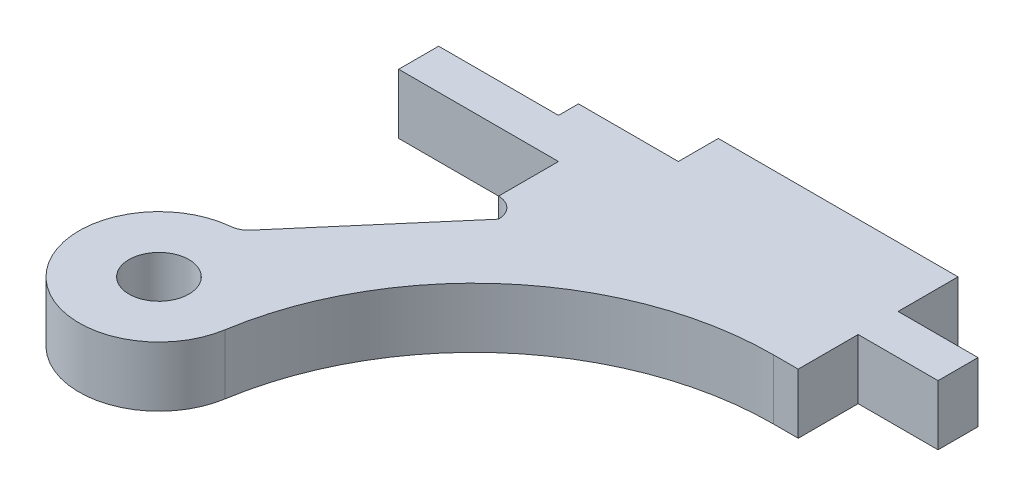
ISO-10303-21;
HEADER;
FILE_DESCRIPTION(('STEP AP214'),'2;1');
FILE_NAME('part.step','',(''),(''),'','','');
FILE_SCHEMA(('AUTOMOTIVE_DESIGN { 1 0 10303 214 1 1 1 1 }'));
ENDSEC;
DATA;
#1=APPLICATION_CONTEXT('core data for automotive mechanical design processes');
#2=APPLICATION_PROTOCOL_DEFINITION('international standard','automotive_design',2000,#1);
#3=PRODUCT_CONTEXT('',#1,'mechanical');
#4=PRODUCT('Part','Part','',(#3));
#5=PRODUCT_RELATED_PRODUCT_CATEGORY('part','',(#4));
#6=PRODUCT_DEFINITION_FORMATION('','',#4);
#7=PRODUCT_DEFINITION_CONTEXT('part definition',#1,'design');
#8=PRODUCT_DEFINITION('design','',#6,#7);
#9=PRODUCT_DEFINITION_SHAPE('','',#8);
#10=(LENGTH_UNIT() NAMED_UNIT(*) SI_UNIT(.MILLI.,.METRE.));
#11=(NAMED_UNIT(*) PLANE_ANGLE_UNIT() SI_UNIT($,.RADIAN.));
#12=(NAMED_UNIT(*) SI_UNIT($,.STERADIAN.) SOLID_ANGLE_UNIT());
#13=UNCERTAINTY_MEASURE_WITH_UNIT(LENGTH_MEASURE(1.E-05),#10,'distance_accuracy_value','');
#14=(GEOMETRIC_REPRESENTATION_CONTEXT(3) GLOBAL_UNCERTAINTY_ASSIGNED_CONTEXT((#13)) GLOBAL_UNIT_ASSIGNED_CONTEXT((#10,
#11,#12)) REPRESENTATION_CONTEXT('',''));
#15=CARTESIAN_POINT('',(0.,0.,0.));
#16=DIRECTION('',(0.,0.,1.));
#17=DIRECTION('',(1.,0.,0.));
#18=AXIS2_PLACEMENT_3D('',#15,#16,#17);
#19=CARTESIAN_POINT('',(41421.3052724861,-444.93949549037,-1.49999999996192));
#20=DIRECTION('',(0.,1.,0.));
#21=DIRECTION('',(1.,0.,0.));
#22=AXIS2_PLACEMENT_3D('',#19,#20,#21);
#23=PLANE('',#22);
#24=CARTESIAN_POINT('',(41421.3052724861,-444.93949549037,-1.49999999996192));
#25=DIRECTION('',(0.,-1.,0.));
#26=DIRECTION('',(1.,0.,0.));
#27=AXIS2_PLACEMENT_3D('',#24,#25,#26);
#28=CIRCLE('',#27,0.99999999999878);
#29=CARTESIAN_POINT('',(41421.3052724861,-444.93949549037,-2.49999999996181));
#30=VERTEX_POINT('',#29);
#31=CARTESIAN_POINT('',(41422.3052724861,-444.93949549037,-1.49999999996314));
#32=VERTEX_POINT('',#31);
#33=EDGE_CURVE('E238',#30,#32,#28,.T.);
#34=ORIENTED_EDGE('',*,*,#33,.T.);
#35=DIRECTION('',(-0.650791373461382,0.,0.759256602360656));
#36=VECTOR('',#35,1.);
#37=CARTESIAN_POINT('',(41422.3052724861,-444.93949549037,-1.49999999996314));
#38=LINE('',#37,#36);
#39=CARTESIAN_POINT('',(41416.5848242782,-444.93949549037,5.17385624268685));
#40=VERTEX_POINT('',#39);
#41=EDGE_CURVE('E131',#32,#40,#38,.T.);
#42=ORIENTED_EDGE('',*,*,#41,.T.);
#43=CARTESIAN_POINT('',(41415.8255676757,-444.93949549037,4.52306486902837));
#44=DIRECTION('',(0.,-1.,0.));
#45=DIRECTION('',(1.,0.,0.));
#46=AXIS2_PLACEMENT_3D('',#43,#44,#45);
#47=CIRCLE('',#46,1.00000000022187);
#48=CARTESIAN_POINT('',(41415.9215086378,-444.93949549037,5.51845189556954));
#49=VERTEX_POINT('',#48);
#50=EDGE_CURVE('E286',#40,#49,#47,.T.);
#51=ORIENTED_EDGE('',*,*,#50,.T.);
#52=CARTESIAN_POINT('',(41416.3052724861,-444.939495490369,9.50000000003803));
#53=DIRECTION('',(0.,1.,0.));
#54=DIRECTION('',(1.,0.,0.));
#55=AXIS2_PLACEMENT_3D('',#52,#53,#54);
#56=CIRCLE('',#55,3.99999999992394);
#57=CARTESIAN_POINT('',(41420.2550962837,-444.939495490369,10.1315789473974));
#58=VERTEX_POINT('',#57);
#59=EDGE_CURVE('E305',#49,#58,#56,.T.);
#60=ORIENTED_EDGE('',*,*,#59,.T.);
#61=CARTESIAN_POINT('',(41435.0669355253,-444.939495490369,12.500000000038));
#62=DIRECTION('',(0.,-1.,0.));
#63=DIRECTION('',(1.,0.,0.));
#64=AXIS2_PLACEMENT_3D('',#61,#62,#63);
#65=CIRCLE('',#64,14.9999999999983);
#66=CARTESIAN_POINT('',(41435.0669355253,-444.93949549037,-2.49999999995931));
#67=VERTEX_POINT('',#66);
#68=EDGE_CURVE('E302',#58,#67,#65,.T.);
#69=ORIENTED_EDGE('',*,*,#68,.T.);
#70=DIRECTION('',(1.,0.,-2.10687736092604E-12));
#71=VECTOR('',#70,1.);
#72=CARTESIAN_POINT('',(41436.3052724861,-444.93949549037,-2.49999999996192));
#73=LINE('',#72,#71);
#74=CARTESIAN_POINT('',(41436.3052724861,-444.93949549037,-2.49999999996192));
#75=VERTEX_POINT('',#74);
#76=EDGE_CURVE('E304',#67,#75,#73,.T.);
#77=ORIENTED_EDGE('',*,*,#76,.T.);
#78=DIRECTION('',(0.,0.,-1.));
#79=VECTOR('',#78,1.);
#80=CARTESIAN_POINT('',(41436.3052724861,-444.93949549037,-5.49999999996192));
#81=LINE('',#80,#79);
#82=CARTESIAN_POINT('',(41436.3052724861,-444.93949549037,-5.49999999996192));
#83=VERTEX_POINT('',#82);
#84=EDGE_CURVE('E307',#75,#83,#81,.T.);
#85=ORIENTED_EDGE('',*,*,#84,.T.);
#86=DIRECTION('',(1.,0.,0.));
#87=VECTOR('',#86,1.);
#88=CARTESIAN_POINT('',(41440.3052724861,-444.93949549037,-5.49999999996192));
#89=LINE('',#88,#87);
#90=CARTESIAN_POINT('',(41440.3052724861,-444.93949549037,-5.49999999996192));
#91=VERTEX_POINT('',#90);
#92=EDGE_CURVE('E313',#83,#91,#89,.T.);
#93=ORIENTED_EDGE('',*,*,#92,.T.);
#94=DIRECTION('',(0.,0.,-1.));
#95=VECTOR('',#94,1.);
#96=CARTESIAN_POINT('',(41440.3052724861,-444.93949549037,-7.49999999996193));
#97=LINE('',#96,#95);
#98=CARTESIAN_POINT('',(41440.3052724861,-444.93949549037,-7.49999999996193));
#99=VERTEX_POINT('',#98);
#100=EDGE_CURVE('E315',#91,#99,#97,.T.);
#101=ORIENTED_EDGE('',*,*,#100,.T.);
#102=DIRECTION('',(-1.,0.,0.));
#103=VECTOR('',#102,1.);
#104=CARTESIAN_POINT('',(41436.3052724861,-444.93949549037,-7.49999999996193));
#105=LINE('',#104,#103);
#106=CARTESIAN_POINT('',(41436.3052724861,-444.93949549037,-7.49999999996193));
#107=VERTEX_POINT('',#106);
#108=EDGE_CURVE('E317',#99,#107,#105,.T.);
#109=ORIENTED_EDGE('',*,*,#108,.T.);
#110=DIRECTION('',(0.,0.,-1.));
#111=VECTOR('',#110,1.);
#112=CARTESIAN_POINT('',(41436.3052724861,-444.93949549037,-10.4999999999619));
#113=LINE('',#112,#111);
#114=CARTESIAN_POINT('',(41436.3052724861,-444.93949549037,-10.4999999999619));
#115=VERTEX_POINT('',#114);
#116=EDGE_CURVE('E319',#107,#115,#113,.T.);
#117=ORIENTED_EDGE('',*,*,#116,.T.);
#118=DIRECTION('',(-1.,0.,0.));
#119=VECTOR('',#118,1.);
#120=CARTESIAN_POINT('',(41424.3052724861,-444.93949549037,-10.4999999999619));
#121=LINE('',#120,#119);
#122=CARTESIAN_POINT('',(41424.3052724861,-444.93949549037,-10.4999999999619));
#123=VERTEX_POINT('',#122);
#124=EDGE_CURVE('E321',#115,#123,#121,.T.);
#125=ORIENTED_EDGE('',*,*,#124,.T.);
#126=DIRECTION('',(0.,0.,1.));
#127=VECTOR('',#126,1.);
#128=CARTESIAN_POINT('',(41424.3052724861,-444.93949549037,-8.49999999996193));
#129=LINE('',#128,#127);
#130=CARTESIAN_POINT('',(41424.3052724861,-444.93949549037,-8.49999999996193));
#131=VERTEX_POINT('',#130);
#132=EDGE_CURVE('E323',#123,#131,#129,.T.);
#133=ORIENTED_EDGE('',*,*,#132,.T.);
#134=DIRECTION('',(-1.,0.,0.));
#135=VECTOR('',#134,1.);
#136=CARTESIAN_POINT('',(41419.3052724861,-444.93949549037,-8.49999999996193));
#137=LINE('',#136,#135);
#138=CARTESIAN_POINT('',(41419.3052724861,-444.93949549037,-8.49999999996193));
#139=VERTEX_POINT('',#138);
#140=EDGE_CURVE('E325',#131,#139,#137,.T.);
#141=ORIENTED_EDGE('',*,*,#140,.T.);
#142=DIRECTION('',(0.,0.,1.));
#143=VECTOR('',#142,1.);
#144=CARTESIAN_POINT('',(41419.3052724861,-444.93949549037,-7.49999999996198));
#145=LINE('',#144,#143);
#146=CARTESIAN_POINT('',(41419.3052724861,-444.93949549037,-7.49999999996198));
#147=VERTEX_POINT('',#146);
#148=EDGE_CURVE('E327',#139,#147,#145,.T.);
#149=ORIENTED_EDGE('',*,*,#148,.T.);
#150=DIRECTION('',(-1.,0.,0.));
#151=VECTOR('',#150,1.);
#152=CARTESIAN_POINT('',(41413.3052724861,-444.93949549037,-7.49999999996198));
#153=LINE('',#152,#151);
#154=CARTESIAN_POINT('',(41413.3052724861,-444.93949549037,-7.49999999996198));
#155=VERTEX_POINT('',#154);
#156=EDGE_CURVE('E183',#147,#155,#153,.T.);
#157=ORIENTED_EDGE('',*,*,#156,.T.);
#158=DIRECTION('',(0.,0.,1.));
#159=VECTOR('',#158,1.);
#160=CARTESIAN_POINT('',(41413.3052724861,-444.93949549037,-5.49999999996187));
#161=LINE('',#160,#159);
#162=CARTESIAN_POINT('',(41413.3052724861,-444.93949549037,-5.49999999996187));
#163=VERTEX_POINT('',#162);
#164=EDGE_CURVE('E177',#155,#163,#161,.T.);
#165=ORIENTED_EDGE('',*,*,#164,.T.);
#166=DIRECTION('',(1.,0.,0.));
#167=VECTOR('',#166,1.);
#168=CARTESIAN_POINT('',(41421.3052724861,-444.93949549037,-5.49999999996187));
#169=LINE('',#168,#167);
#170=CARTESIAN_POINT('',(41421.3052724861,-444.93949549037,-5.49999999996187));
#171=VERTEX_POINT('',#170);
#172=EDGE_CURVE('E181',#163,#171,#169,.T.);
#173=ORIENTED_EDGE('',*,*,#172,.T.);
#174=DIRECTION('',(0.,0.,1.));
#175=VECTOR('',#174,1.);
#176=CARTESIAN_POINT('',(41421.3052724861,-444.93949549037,-2.49999999996181));
#177=LINE('',#176,#175);
#178=EDGE_CURVE('E55',#171,#30,#177,.T.);
#179=ORIENTED_EDGE('',*,*,#178,.T.);
#180=EDGE_LOOP('',(#34,#42,#51,#60,#69,#77,#85,#93,#101,#109,#117,#125,#133,#141,#149,#157,#165,
#173,#179));
#181=FACE_BOUND('',#180,.T.);
#182=CARTESIAN_POINT('',(41416.3052724861,-444.939495490369,9.50000000003803));
#183=DIRECTION('',(0.,1.,0.));
#184=DIRECTION('',(1.,0.,0.));
#185=AXIS2_PLACEMENT_3D('',#182,#183,#184);
#186=CIRCLE('',#185,1.50000000000178);
#187=CARTESIAN_POINT('',(41417.8052724861,-444.939495490369,9.50000000003803));
#188=VERTEX_POINT('',#187);
#189=EDGE_CURVE('E205',#188,#188,#186,.T.);
#190=ORIENTED_EDGE('',*,*,#189,.F.);
#191=EDGE_LOOP('',(#190));
#192=FACE_BOUND('',#191,.T.);
#193=ADVANCED_FACE('F38',(#181,#192),#23,.T.);
#194=CARTESIAN_POINT('',(41421.3052724861,-447.93949549037,-1.49999999996192));
#195=DIRECTION('',(0.,1.,0.));
#196=DIRECTION('',(1.,0.,0.));
#197=AXIS2_PLACEMENT_3D('',#194,#195,#196);
#198=PLANE('',#197);
#199=CARTESIAN_POINT('',(41421.3052724861,-447.93949549037,-1.49999999996192));
#200=DIRECTION('',(0.,-1.,0.));
#201=DIRECTION('',(1.,0.,0.));
#202=AXIS2_PLACEMENT_3D('',#199,#200,#201);
#203=CIRCLE('',#202,0.99999999999878);
#204=CARTESIAN_POINT('',(41421.3052724861,-447.93949549037,-2.49999999996181));
#205=VERTEX_POINT('',#204);
#206=CARTESIAN_POINT('',(41422.3052724861,-447.93949549037,-1.49999999996314));
#207=VERTEX_POINT('',#206);
#208=EDGE_CURVE('E201',#205,#207,#203,.T.);
#209=ORIENTED_EDGE('',*,*,#208,.F.);
#210=DIRECTION('',(0.,0.,1.));
#211=VECTOR('',#210,1.);
#212=CARTESIAN_POINT('',(41421.3052724861,-447.93949549037,-2.49999999996181));
#213=LINE('',#212,#211);
#214=CARTESIAN_POINT('',(41421.3052724861,-447.93949549037,-5.49999999996187));
#215=VERTEX_POINT('',#214);
#216=EDGE_CURVE('E123',#215,#205,#213,.T.);
#217=ORIENTED_EDGE('',*,*,#216,.F.);
#218=DIRECTION('',(1.,0.,0.));
#219=VECTOR('',#218,1.);
#220=CARTESIAN_POINT('',(41421.3052724861,-447.93949549037,-5.49999999996187));
#221=LINE('',#220,#219);
#222=CARTESIAN_POINT('',(41413.3052724861,-447.93949549037,-5.49999999996187));
#223=VERTEX_POINT('',#222);
#224=EDGE_CURVE('E117',#223,#215,#221,.T.);
#225=ORIENTED_EDGE('',*,*,#224,.F.);
#226=DIRECTION('',(0.,0.,1.));
#227=VECTOR('',#226,1.);
#228=CARTESIAN_POINT('',(41413.3052724861,-447.93949549037,-5.49999999996187));
#229=LINE('',#228,#227);
#230=CARTESIAN_POINT('',(41413.3052724861,-447.93949549037,-7.49999999996198));
#231=VERTEX_POINT('',#230);
#232=EDGE_CURVE('E191',#231,#223,#229,.T.);
#233=ORIENTED_EDGE('',*,*,#232,.F.);
#234=DIRECTION('',(-1.,0.,0.));
#235=VECTOR('',#234,1.);
#236=CARTESIAN_POINT('',(41413.3052724861,-447.93949549037,-7.49999999996198));
#237=LINE('',#236,#235);
#238=CARTESIAN_POINT('',(41419.3052724861,-447.93949549037,-7.49999999996198));
#239=VERTEX_POINT('',#238);
#240=EDGE_CURVE('E233',#239,#231,#237,.T.);
#241=ORIENTED_EDGE('',*,*,#240,.F.);
#242=DIRECTION('',(0.,0.,1.));
#243=VECTOR('',#242,1.);
#244=CARTESIAN_POINT('',(41419.3052724861,-447.93949549037,-7.49999999996198));
#245=LINE('',#244,#243);
#246=CARTESIAN_POINT('',(41419.3052724861,-447.93949549037,-8.49999999996193));
#247=VERTEX_POINT('',#246);
#248=EDGE_CURVE('E231',#247,#239,#245,.T.);
#249=ORIENTED_EDGE('',*,*,#248,.F.);
#250=DIRECTION('',(-1.,0.,0.));
#251=VECTOR('',#250,1.);
#252=CARTESIAN_POINT('',(41419.3052724861,-447.93949549037,-8.49999999996193));
#253=LINE('',#252,#251);
#254=CARTESIAN_POINT('',(41424.3052724861,-447.93949549037,-8.49999999996193));
#255=VERTEX_POINT('',#254);
#256=EDGE_CURVE('E229',#255,#247,#253,.T.);
#257=ORIENTED_EDGE('',*,*,#256,.F.);
#258=DIRECTION('',(0.,0.,1.));
#259=VECTOR('',#258,1.);
#260=CARTESIAN_POINT('',(41424.3052724861,-447.93949549037,-8.49999999996193));
#261=LINE('',#260,#259);
#262=CARTESIAN_POINT('',(41424.3052724861,-447.93949549037,-10.4999999999619));
#263=VERTEX_POINT('',#262);
#264=EDGE_CURVE('E227',#263,#255,#261,.T.);
#265=ORIENTED_EDGE('',*,*,#264,.F.);
#266=DIRECTION('',(-1.,0.,0.));
#267=VECTOR('',#266,1.);
#268=CARTESIAN_POINT('',(41424.3052724861,-447.93949549037,-10.4999999999619));
#269=LINE('',#268,#267);
#270=CARTESIAN_POINT('',(41436.3052724861,-447.93949549037,-10.4999999999619));
#271=VERTEX_POINT('',#270);
#272=EDGE_CURVE('E225',#271,#263,#269,.T.);
#273=ORIENTED_EDGE('',*,*,#272,.F.);
#274=DIRECTION('',(0.,0.,-1.));
#275=VECTOR('',#274,1.);
#276=CARTESIAN_POINT('',(41436.3052724861,-447.93949549037,-10.4999999999619));
#277=LINE('',#276,#275);
#278=CARTESIAN_POINT('',(41436.3052724861,-447.93949549037,-7.49999999996193));
#279=VERTEX_POINT('',#278);
#280=EDGE_CURVE('E223',#279,#271,#277,.T.);
#281=ORIENTED_EDGE('',*,*,#280,.F.);
#282=DIRECTION('',(-1.,0.,0.));
#283=VECTOR('',#282,1.);
#284=CARTESIAN_POINT('',(41436.3052724861,-447.93949549037,-7.49999999996193));
#285=LINE('',#284,#283);
#286=CARTESIAN_POINT('',(41440.3052724861,-447.93949549037,-7.49999999996193));
#287=VERTEX_POINT('',#286);
#288=EDGE_CURVE('E221',#287,#279,#285,.T.);
#289=ORIENTED_EDGE('',*,*,#288,.F.);
#290=DIRECTION('',(0.,0.,-1.));
#291=VECTOR('',#290,1.);
#292=CARTESIAN_POINT('',(41440.3052724861,-447.93949549037,-7.49999999996193));
#293=LINE('',#292,#291);
#294=CARTESIAN_POINT('',(41440.3052724861,-447.93949549037,-5.49999999996192));
#295=VERTEX_POINT('',#294);
#296=EDGE_CURVE('E219',#295,#287,#293,.T.);
#297=ORIENTED_EDGE('',*,*,#296,.F.);
#298=DIRECTION('',(1.,0.,0.));
#299=VECTOR('',#298,1.);
#300=CARTESIAN_POINT('',(41440.3052724861,-447.93949549037,-5.49999999996192));
#301=LINE('',#300,#299);
#302=CARTESIAN_POINT('',(41436.3052724861,-447.93949549037,-5.49999999996192));
#303=VERTEX_POINT('',#302);
#304=EDGE_CURVE('E217',#303,#295,#301,.T.);
#305=ORIENTED_EDGE('',*,*,#304,.F.);
#306=DIRECTION('',(0.,0.,-1.));
#307=VECTOR('',#306,1.);
#308=CARTESIAN_POINT('',(41436.3052724861,-447.93949549037,-5.49999999996192));
#309=LINE('',#308,#307);
#310=CARTESIAN_POINT('',(41436.3052724861,-447.93949549037,-2.49999999996192));
#311=VERTEX_POINT('',#310);
#312=EDGE_CURVE('E215',#311,#303,#309,.T.);
#313=ORIENTED_EDGE('',*,*,#312,.F.);
#314=DIRECTION('',(1.,0.,-2.10687736092604E-12));
#315=VECTOR('',#314,1.);
#316=CARTESIAN_POINT('',(41436.3052724861,-447.93949549037,-2.49999999996192));
#317=LINE('',#316,#315);
#318=CARTESIAN_POINT('',(41435.0669355253,-447.93949549037,-2.49999999995931));
#319=VERTEX_POINT('',#318);
#320=EDGE_CURVE('E213',#319,#311,#317,.T.);
#321=ORIENTED_EDGE('',*,*,#320,.F.);
#322=CARTESIAN_POINT('',(41435.0669355253,-447.939495490369,12.500000000038));
#323=DIRECTION('',(0.,-1.,0.));
#324=DIRECTION('',(1.,0.,0.));
#325=AXIS2_PLACEMENT_3D('',#322,#323,#324);
#326=CIRCLE('',#325,14.9999999999983);
#327=CARTESIAN_POINT('',(41420.2550962837,-447.939495490369,10.1315789473974));
#328=VERTEX_POINT('',#327);
#329=EDGE_CURVE('E211',#328,#319,#326,.T.);
#330=ORIENTED_EDGE('',*,*,#329,.F.);
#331=CARTESIAN_POINT('',(41416.3052724861,-447.939495490369,9.50000000003803));
#332=DIRECTION('',(0.,1.,0.));
#333=DIRECTION('',(1.,0.,0.));
#334=AXIS2_PLACEMENT_3D('',#331,#332,#333);
#335=CIRCLE('',#334,3.99999999992394);
#336=CARTESIAN_POINT('',(41415.9215086378,-447.93949549037,5.51845189556954));
#337=VERTEX_POINT('',#336);
#338=EDGE_CURVE('E209',#337,#328,#335,.T.);
#339=ORIENTED_EDGE('',*,*,#338,.F.);
#340=CARTESIAN_POINT('',(41415.8255676757,-447.93949549037,4.52306486902837));
#341=DIRECTION('',(0.,-1.,0.));
#342=DIRECTION('',(1.,0.,0.));
#343=AXIS2_PLACEMENT_3D('',#340,#341,#342);
#344=CIRCLE('',#343,1.00000000022187);
#345=CARTESIAN_POINT('',(41416.5848242782,-447.93949549037,5.17385624268685));
#346=VERTEX_POINT('',#345);
#347=EDGE_CURVE('E207',#346,#337,#344,.T.);
#348=ORIENTED_EDGE('',*,*,#347,.F.);
#349=DIRECTION('',(-0.650791373461382,0.,0.759256602360656));
#350=VECTOR('',#349,1.);
#351=CARTESIAN_POINT('',(41422.3052724861,-447.93949549037,-1.49999999996314));
#352=LINE('',#351,#350);
#353=EDGE_CURVE('E204',#207,#346,#352,.T.);
#354=ORIENTED_EDGE('',*,*,#353,.F.);
#355=EDGE_LOOP('',(#209,#217,#225,#233,#241,#249,#257,#265,#273,#281,#289,#297,#305,#313,#321,
#330,#339,#348,#354));
#356=FACE_BOUND('',#355,.T.);
#357=CARTESIAN_POINT('',(41416.3052724861,-447.939495490369,9.50000000003803));
#358=DIRECTION('',(0.,1.,0.));
#359=DIRECTION('',(1.,0.,0.));
#360=AXIS2_PLACEMENT_3D('',#357,#358,#359);
#361=CIRCLE('',#360,1.50000000000178);
#362=CARTESIAN_POINT('',(41417.8052724861,-447.939495490369,9.50000000003803));
#363=VERTEX_POINT('',#362);
#364=EDGE_CURVE('E565',#363,#363,#361,.T.);
#365=ORIENTED_EDGE('',*,*,#364,.T.);
#366=EDGE_LOOP('',(#365));
#367=FACE_BOUND('',#366,.T.);
#368=ADVANCED_FACE('F290',(#356,#367),#198,.F.);
#369=CARTESIAN_POINT('',(41421.3052724861,-444.93949549037,-1.49999999996192));
#370=DIRECTION('',(0.,-1.,0.));
#371=DIRECTION('',(-1.,0.,0.));
#372=AXIS2_PLACEMENT_3D('',#369,#370,#371);
#373=CYLINDRICAL_SURFACE('',#372,0.99999999999878);
#374=ORIENTED_EDGE('',*,*,#208,.T.);
#375=DIRECTION('',(0.,-1.,0.));
#376=VECTOR('',#375,1.);
#377=CARTESIAN_POINT('',(41422.3052724861,-444.93949549037,-1.49999999996314));
#378=LINE('',#377,#376);
#379=EDGE_CURVE('E11',#32,#207,#378,.T.);
#380=ORIENTED_EDGE('',*,*,#379,.F.);
#381=ORIENTED_EDGE('',*,*,#33,.F.);
#382=DIRECTION('',(0.,-1.,0.));
#383=VECTOR('',#382,1.);
#384=CARTESIAN_POINT('',(41421.3052724861,-444.93949549037,-2.49999999996181));
#385=LINE('',#384,#383);
#386=EDGE_CURVE('E197',#30,#205,#385,.T.);
#387=ORIENTED_EDGE('',*,*,#386,.T.);
#388=EDGE_LOOP('',(#374,#380,#381,#387));
#389=FACE_BOUND('',#388,.T.);
#390=ADVANCED_FACE('F40',(#389),#373,.F.);
#391=CARTESIAN_POINT('',(41422.3052724861,-444.93949549037,-1.49999999996314));
#392=DIRECTION('',(0.759256602360656,0.,0.650791373461383));
#393=DIRECTION('',(0.650791373461383,0.,-0.759256602360656));
#394=AXIS2_PLACEMENT_3D('',#391,#392,#393);
#395=PLANE('',#394);
#396=ORIENTED_EDGE('',*,*,#353,.T.);
#397=DIRECTION('',(0.,-1.,0.));
#398=VECTOR('',#397,1.);
#399=CARTESIAN_POINT('',(41416.5848242782,-444.93949549037,5.17385624268685));
#400=LINE('',#399,#398);
#401=EDGE_CURVE('E47',#40,#346,#400,.T.);
#402=ORIENTED_EDGE('',*,*,#401,.F.);
#403=ORIENTED_EDGE('',*,*,#41,.F.);
#404=ORIENTED_EDGE('',*,*,#379,.T.);
#405=EDGE_LOOP('',(#396,#402,#403,#404));
#406=FACE_BOUND('',#405,.T.);
#407=ADVANCED_FACE('F361',(#406),#395,.F.);
#408=CARTESIAN_POINT('',(41415.8255676757,-444.93949549037,4.52306486902837));
#409=DIRECTION('',(0.,-1.,0.));
#410=DIRECTION('',(-1.,0.,0.));
#411=AXIS2_PLACEMENT_3D('',#408,#409,#410);
#412=CYLINDRICAL_SURFACE('',#411,1.00000000022187);
#413=ORIENTED_EDGE('',*,*,#347,.T.);
#414=DIRECTION('',(0.,-1.,0.));
#415=VECTOR('',#414,1.);
#416=CARTESIAN_POINT('',(41415.9215086378,-444.93949549037,5.51845189556954));
#417=LINE('',#416,#415);
#418=EDGE_CURVE('E278',#49,#337,#417,.T.);
#419=ORIENTED_EDGE('',*,*,#418,.F.);
#420=ORIENTED_EDGE('',*,*,#50,.F.);
#421=ORIENTED_EDGE('',*,*,#401,.T.);
#422=EDGE_LOOP('',(#413,#419,#420,#421));
#423=FACE_BOUND('',#422,.T.);
#424=ADVANCED_FACE('F284',(#423),#412,.F.);
#425=CARTESIAN_POINT('',(41416.3052724861,-444.939495490369,9.50000000003803));
#426=DIRECTION('',(0.,-1.,0.));
#427=DIRECTION('',(-1.,0.,0.));
#428=AXIS2_PLACEMENT_3D('',#425,#426,#427);
#429=CYLINDRICAL_SURFACE('',#428,3.99999999992394);
#430=ORIENTED_EDGE('',*,*,#338,.T.);
#431=DIRECTION('',(0.,-1.,0.));
#432=VECTOR('',#431,1.);
#433=CARTESIAN_POINT('',(41420.2550962837,-444.939495490369,10.1315789473974));
#434=LINE('',#433,#432);
#435=EDGE_CURVE('E275',#58,#328,#434,.T.);
#436=ORIENTED_EDGE('',*,*,#435,.F.);
#437=ORIENTED_EDGE('',*,*,#59,.F.);
#438=ORIENTED_EDGE('',*,*,#418,.T.);
#439=EDGE_LOOP('',(#430,#436,#437,#438));
#440=FACE_BOUND('',#439,.T.);
#441=ADVANCED_FACE('F296',(#440),#429,.T.);
#442=CARTESIAN_POINT('',(41435.0669355253,-444.939495490369,12.500000000038));
#443=DIRECTION('',(0.,-1.,0.));
#444=DIRECTION('',(-1.,0.,0.));
#445=AXIS2_PLACEMENT_3D('',#442,#443,#444);
#446=CYLINDRICAL_SURFACE('',#445,14.9999999999983);
#447=ORIENTED_EDGE('',*,*,#329,.T.);
#448=DIRECTION('',(0.,-1.,0.));
#449=VECTOR('',#448,1.);
#450=CARTESIAN_POINT('',(41435.0669355253,-444.93949549037,-2.49999999995931));
#451=LINE('',#450,#449);
#452=EDGE_CURVE('E272',#67,#319,#451,.T.);
#453=ORIENTED_EDGE('',*,*,#452,.F.);
#454=ORIENTED_EDGE('',*,*,#68,.F.);
#455=ORIENTED_EDGE('',*,*,#435,.T.);
#456=EDGE_LOOP('',(#447,#453,#454,#455));
#457=FACE_BOUND('',#456,.T.);
#458=ADVANCED_FACE('F300',(#457),#446,.F.);
#459=CARTESIAN_POINT('',(41436.3052724861,-444.93949549037,-2.49999999996192));
#460=DIRECTION('',(-2.10687736092604E-12,0.,-1.));
#461=DIRECTION('',(-1.,0.,2.10687736092604E-12));
#462=AXIS2_PLACEMENT_3D('',#459,#460,#461);
#463=PLANE('',#462);
#464=ORIENTED_EDGE('',*,*,#320,.T.);
#465=DIRECTION('',(0.,-1.,0.));
#466=VECTOR('',#465,1.);
#467=CARTESIAN_POINT('',(41436.3052724861,-444.93949549037,-2.49999999996192));
#468=LINE('',#467,#466);
#469=EDGE_CURVE('E269',#75,#311,#468,.T.);
#470=ORIENTED_EDGE('',*,*,#469,.F.);
#471=ORIENTED_EDGE('',*,*,#76,.F.);
#472=ORIENTED_EDGE('',*,*,#452,.T.);
#473=EDGE_LOOP('',(#464,#470,#471,#472));
#474=FACE_BOUND('',#473,.T.);
#475=ADVANCED_FACE('F374',(#474),#463,.F.);
#476=CARTESIAN_POINT('',(41436.3052724861,-444.93949549037,-5.49999999996192));
#477=DIRECTION('',(-1.,0.,0.));
#478=DIRECTION('',(0.,1.,0.));
#479=AXIS2_PLACEMENT_3D('',#476,#477,#478);
#480=PLANE('',#479);
#481=ORIENTED_EDGE('',*,*,#312,.T.);
#482=DIRECTION('',(0.,-1.,0.));
#483=VECTOR('',#482,1.);
#484=CARTESIAN_POINT('',(41436.3052724861,-444.93949549037,-5.49999999996192));
#485=LINE('',#484,#483);
#486=EDGE_CURVE('E266',#83,#303,#485,.T.);
#487=ORIENTED_EDGE('',*,*,#486,.F.);
#488=ORIENTED_EDGE('',*,*,#84,.F.);
#489=ORIENTED_EDGE('',*,*,#469,.T.);
#490=EDGE_LOOP('',(#481,#487,#488,#489));
#491=FACE_BOUND('',#490,.T.);
#492=ADVANCED_FACE('F377',(#491),#480,.F.);
#493=CARTESIAN_POINT('',(41440.3052724861,-444.93949549037,-5.49999999996192));
#494=DIRECTION('',(0.,0.,-1.));
#495=DIRECTION('',(0.,1.,0.));
#496=AXIS2_PLACEMENT_3D('',#493,#494,#495);
#497=PLANE('',#496);
#498=ORIENTED_EDGE('',*,*,#304,.T.);
#499=DIRECTION('',(0.,-1.,0.));
#500=VECTOR('',#499,1.);
#501=CARTESIAN_POINT('',(41440.3052724861,-444.93949549037,-5.49999999996192));
#502=LINE('',#501,#500);
#503=EDGE_CURVE('E263',#91,#295,#502,.T.);
#504=ORIENTED_EDGE('',*,*,#503,.F.);
#505=ORIENTED_EDGE('',*,*,#92,.F.);
#506=ORIENTED_EDGE('',*,*,#486,.T.);
#507=EDGE_LOOP('',(#498,#504,#505,#506));
#508=FACE_BOUND('',#507,.T.);
#509=ADVANCED_FACE('F381',(#508),#497,.F.);
#510=CARTESIAN_POINT('',(41440.3052724861,-444.93949549037,-7.49999999996193));
#511=DIRECTION('',(-1.,0.,0.));
#512=DIRECTION('',(0.,1.,0.));
#513=AXIS2_PLACEMENT_3D('',#510,#511,#512);
#514=PLANE('',#513);
#515=ORIENTED_EDGE('',*,*,#296,.T.);
#516=DIRECTION('',(0.,-1.,0.));
#517=VECTOR('',#516,1.);
#518=CARTESIAN_POINT('',(41440.3052724861,-444.93949549037,-7.49999999996193));
#519=LINE('',#518,#517);
#520=EDGE_CURVE('E260',#99,#287,#519,.T.);
#521=ORIENTED_EDGE('',*,*,#520,.F.);
#522=ORIENTED_EDGE('',*,*,#100,.F.);
#523=ORIENTED_EDGE('',*,*,#503,.T.);
#524=EDGE_LOOP('',(#515,#521,#522,#523));
#525=FACE_BOUND('',#524,.T.);
#526=ADVANCED_FACE('F385',(#525),#514,.F.);
#527=CARTESIAN_POINT('',(41436.3052724861,-444.93949549037,-7.49999999996193));
#528=DIRECTION('',(0.,0.,1.));
#529=DIRECTION('',(0.,-1.,0.));
#530=AXIS2_PLACEMENT_3D('',#527,#528,#529);
#531=PLANE('',#530);
#532=ORIENTED_EDGE('',*,*,#288,.T.);
#533=DIRECTION('',(0.,-1.,0.));
#534=VECTOR('',#533,1.);
#535=CARTESIAN_POINT('',(41436.3052724861,-444.93949549037,-7.49999999996193));
#536=LINE('',#535,#534);
#537=EDGE_CURVE('E257',#107,#279,#536,.T.);
#538=ORIENTED_EDGE('',*,*,#537,.F.);
#539=ORIENTED_EDGE('',*,*,#108,.F.);
#540=ORIENTED_EDGE('',*,*,#520,.T.);
#541=EDGE_LOOP('',(#532,#538,#539,#540));
#542=FACE_BOUND('',#541,.T.);
#543=ADVANCED_FACE('F389',(#542),#531,.F.);
#544=CARTESIAN_POINT('',(41436.3052724861,-444.93949549037,-10.4999999999619));
#545=DIRECTION('',(-1.,0.,0.));
#546=DIRECTION('',(0.,1.,0.));
#547=AXIS2_PLACEMENT_3D('',#544,#545,#546);
#548=PLANE('',#547);
#549=ORIENTED_EDGE('',*,*,#280,.T.);
#550=DIRECTION('',(0.,-1.,0.));
#551=VECTOR('',#550,1.);
#552=CARTESIAN_POINT('',(41436.3052724861,-444.93949549037,-10.4999999999619));
#553=LINE('',#552,#551);
#554=EDGE_CURVE('E254',#115,#271,#553,.T.);
#555=ORIENTED_EDGE('',*,*,#554,.F.);
#556=ORIENTED_EDGE('',*,*,#116,.F.);
#557=ORIENTED_EDGE('',*,*,#537,.T.);
#558=EDGE_LOOP('',(#549,#555,#556,#557));
#559=FACE_BOUND('',#558,.T.);
#560=ADVANCED_FACE('F393',(#559),#548,.F.);
#561=CARTESIAN_POINT('',(41424.3052724861,-444.93949549037,-10.4999999999619));
#562=DIRECTION('',(0.,0.,1.));
#563=DIRECTION('',(0.,-1.,0.));
#564=AXIS2_PLACEMENT_3D('',#561,#562,#563);
#565=PLANE('',#564);
#566=ORIENTED_EDGE('',*,*,#272,.T.);
#567=DIRECTION('',(0.,-1.,0.));
#568=VECTOR('',#567,1.);
#569=CARTESIAN_POINT('',(41424.3052724861,-444.93949549037,-10.4999999999619));
#570=LINE('',#569,#568);
#571=EDGE_CURVE('E251',#123,#263,#570,.T.);
#572=ORIENTED_EDGE('',*,*,#571,.F.);
#573=ORIENTED_EDGE('',*,*,#124,.F.);
#574=ORIENTED_EDGE('',*,*,#554,.T.);
#575=EDGE_LOOP('',(#566,#572,#573,#574));
#576=FACE_BOUND('',#575,.T.);
#577=ADVANCED_FACE('F397',(#576),#565,.F.);
#578=CARTESIAN_POINT('',(41424.3052724861,-444.93949549037,-8.49999999996193));
#579=DIRECTION('',(1.,0.,0.));
#580=DIRECTION('',(0.,-1.,0.));
#581=AXIS2_PLACEMENT_3D('',#578,#579,#580);
#582=PLANE('',#581);
#583=ORIENTED_EDGE('',*,*,#264,.T.);
#584=DIRECTION('',(0.,-1.,0.));
#585=VECTOR('',#584,1.);
#586=CARTESIAN_POINT('',(41424.3052724861,-444.93949549037,-8.49999999996193));
#587=LINE('',#586,#585);
#588=EDGE_CURVE('E248',#131,#255,#587,.T.);
#589=ORIENTED_EDGE('',*,*,#588,.F.);
#590=ORIENTED_EDGE('',*,*,#132,.F.);
#591=ORIENTED_EDGE('',*,*,#571,.T.);
#592=EDGE_LOOP('',(#583,#589,#590,#591));
#593=FACE_BOUND('',#592,.T.);
#594=ADVANCED_FACE('F401',(#593),#582,.F.);
#595=CARTESIAN_POINT('',(41419.3052724861,-444.93949549037,-8.49999999996193));
#596=DIRECTION('',(0.,0.,1.));
#597=DIRECTION('',(0.,-1.,0.));
#598=AXIS2_PLACEMENT_3D('',#595,#596,#597);
#599=PLANE('',#598);
#600=ORIENTED_EDGE('',*,*,#256,.T.);
#601=DIRECTION('',(0.,-1.,0.));
#602=VECTOR('',#601,1.);
#603=CARTESIAN_POINT('',(41419.3052724861,-444.93949549037,-8.49999999996193));
#604=LINE('',#603,#602);
#605=EDGE_CURVE('E245',#139,#247,#604,.T.);
#606=ORIENTED_EDGE('',*,*,#605,.F.);
#607=ORIENTED_EDGE('',*,*,#140,.F.);
#608=ORIENTED_EDGE('',*,*,#588,.T.);
#609=EDGE_LOOP('',(#600,#606,#607,#608));
#610=FACE_BOUND('',#609,.T.);
#611=ADVANCED_FACE('F405',(#610),#599,.F.);
#612=CARTESIAN_POINT('',(41419.3052724861,-444.93949549037,-7.49999999996198));
#613=DIRECTION('',(1.,0.,0.));
#614=DIRECTION('',(0.,-1.,0.));
#615=AXIS2_PLACEMENT_3D('',#612,#613,#614);
#616=PLANE('',#615);
#617=ORIENTED_EDGE('',*,*,#248,.T.);
#618=DIRECTION('',(0.,-1.,0.));
#619=VECTOR('',#618,1.);
#620=CARTESIAN_POINT('',(41419.3052724861,-444.93949549037,-7.49999999996198));
#621=LINE('',#620,#619);
#622=EDGE_CURVE('E242',#147,#239,#621,.T.);
#623=ORIENTED_EDGE('',*,*,#622,.F.);
#624=ORIENTED_EDGE('',*,*,#148,.F.);
#625=ORIENTED_EDGE('',*,*,#605,.T.);
#626=EDGE_LOOP('',(#617,#623,#624,#625));
#627=FACE_BOUND('',#626,.T.);
#628=ADVANCED_FACE('F333',(#627),#616,.F.);
#629=CARTESIAN_POINT('',(41413.3052724861,-444.93949549037,-7.49999999996198));
#630=DIRECTION('',(0.,0.,1.));
#631=DIRECTION('',(0.,-1.,0.));
#632=AXIS2_PLACEMENT_3D('',#629,#630,#631);
#633=PLANE('',#632);
#634=ORIENTED_EDGE('',*,*,#240,.T.);
#635=DIRECTION('',(0.,-1.,0.));
#636=VECTOR('',#635,1.);
#637=CARTESIAN_POINT('',(41413.3052724861,-444.93949549037,-7.49999999996198));
#638=LINE('',#637,#636);
#639=EDGE_CURVE('E192',#155,#231,#638,.T.);
#640=ORIENTED_EDGE('',*,*,#639,.F.);
#641=ORIENTED_EDGE('',*,*,#156,.F.);
#642=ORIENTED_EDGE('',*,*,#622,.T.);
#643=EDGE_LOOP('',(#634,#640,#641,#642));
#644=FACE_BOUND('',#643,.T.);
#645=ADVANCED_FACE('F337',(#644),#633,.F.);
#646=CARTESIAN_POINT('',(41413.3052724861,-444.93949549037,-5.49999999996187));
#647=DIRECTION('',(1.,0.,0.));
#648=DIRECTION('',(0.,-1.,0.));
#649=AXIS2_PLACEMENT_3D('',#646,#647,#648);
#650=PLANE('',#649);
#651=ORIENTED_EDGE('',*,*,#232,.T.);
#652=DIRECTION('',(0.,-1.,0.));
#653=VECTOR('',#652,1.);
#654=CARTESIAN_POINT('',(41413.3052724861,-444.93949549037,-5.49999999996187));
#655=LINE('',#654,#653);
#656=EDGE_CURVE('E188',#163,#223,#655,.T.);
#657=ORIENTED_EDGE('',*,*,#656,.F.);
#658=ORIENTED_EDGE('',*,*,#164,.F.);
#659=ORIENTED_EDGE('',*,*,#639,.T.);
#660=EDGE_LOOP('',(#651,#657,#658,#659));
#661=FACE_BOUND('',#660,.T.);
#662=ADVANCED_FACE('F189',(#661),#650,.F.);
#663=CARTESIAN_POINT('',(41421.3052724861,-444.93949549037,-5.49999999996187));
#664=DIRECTION('',(0.,0.,-1.));
#665=DIRECTION('',(0.,1.,0.));
#666=AXIS2_PLACEMENT_3D('',#663,#664,#665);
#667=PLANE('',#666);
#668=ORIENTED_EDGE('',*,*,#224,.T.);
#669=DIRECTION('',(0.,-1.,0.));
#670=VECTOR('',#669,1.);
#671=CARTESIAN_POINT('',(41421.3052724861,-444.93949549037,-5.49999999996187));
#672=LINE('',#671,#670);
#673=EDGE_CURVE('E193',#171,#215,#672,.T.);
#674=ORIENTED_EDGE('',*,*,#673,.F.);
#675=ORIENTED_EDGE('',*,*,#172,.F.);
#676=ORIENTED_EDGE('',*,*,#656,.T.);
#677=EDGE_LOOP('',(#668,#674,#675,#676));
#678=FACE_BOUND('',#677,.T.);
#679=ADVANCED_FACE('F195',(#678),#667,.F.);
#680=CARTESIAN_POINT('',(41421.3052724861,-444.93949549037,-2.49999999996181));
#681=DIRECTION('',(1.,0.,0.));
#682=DIRECTION('',(0.,-1.,0.));
#683=AXIS2_PLACEMENT_3D('',#680,#681,#682);
#684=PLANE('',#683);
#685=ORIENTED_EDGE('',*,*,#216,.T.);
#686=ORIENTED_EDGE('',*,*,#386,.F.);
#687=ORIENTED_EDGE('',*,*,#178,.F.);
#688=ORIENTED_EDGE('',*,*,#673,.T.);
#689=EDGE_LOOP('',(#685,#686,#687,#688));
#690=FACE_BOUND('',#689,.T.);
#691=ADVANCED_FACE('F341',(#690),#684,.F.);
#692=CARTESIAN_POINT('',(41416.3052724861,-444.939495490369,9.50000000003803));
#693=DIRECTION('',(0.,-1.,0.));
#694=DIRECTION('',(-1.,0.,0.));
#695=AXIS2_PLACEMENT_3D('',#692,#693,#694);
#696=CYLINDRICAL_SURFACE('',#695,1.50000000000178);
#697=ORIENTED_EDGE('',*,*,#189,.T.);
#698=EDGE_LOOP('',(#697));
#699=FACE_BOUND('',#698,.T.);
#700=ORIENTED_EDGE('',*,*,#364,.F.);
#701=EDGE_LOOP('',(#700));
#702=FACE_BOUND('',#701,.T.);
#703=ADVANCED_FACE('F343',(#699,#702),#696,.F.);
#704=CLOSED_SHELL('',(#193,#368,#390,#407,#424,#441,#458,#475,#492,#509,#526,#543,#560,#577,
#594,#611,#628,#645,#662,#679,#691,#703));
#705=MANIFOLD_SOLID_BREP('B2',#704);
#706=ADVANCED_BREP_SHAPE_REPRESENTATION('',(#18,#705),#14);
#707=SHAPE_DEFINITION_REPRESENTATION(#9,#706);
ENDSEC;
END-ISO-10303-21;
